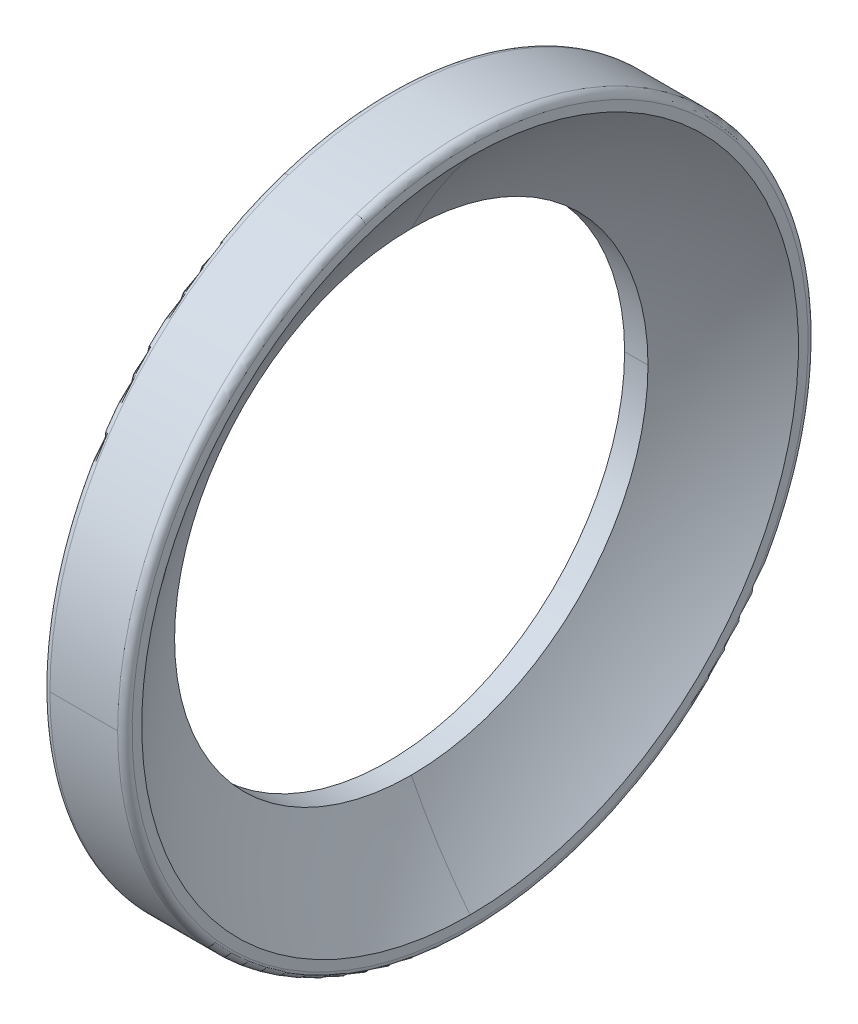
ISO-10303-21;
HEADER;
FILE_DESCRIPTION(('STEP AP214'),'2;1');
FILE_NAME('part.step','',(''),(''),'','','');
FILE_SCHEMA(('AUTOMOTIVE_DESIGN { 1 0 10303 214 1 1 1 1 }'));
ENDSEC;
DATA;
#1=APPLICATION_CONTEXT('core data for automotive mechanical design processes');
#2=APPLICATION_PROTOCOL_DEFINITION('international standard','automotive_design',2000,#1);
#3=PRODUCT_CONTEXT('',#1,'mechanical');
#4=PRODUCT('Part','Part','',(#3));
#5=PRODUCT_RELATED_PRODUCT_CATEGORY('part','',(#4));
#6=PRODUCT_DEFINITION_FORMATION('','',#4);
#7=PRODUCT_DEFINITION_CONTEXT('part definition',#1,'design');
#8=PRODUCT_DEFINITION('design','',#6,#7);
#9=PRODUCT_DEFINITION_SHAPE('','',#8);
#10=(LENGTH_UNIT() NAMED_UNIT(*) SI_UNIT(.MILLI.,.METRE.));
#11=(NAMED_UNIT(*) PLANE_ANGLE_UNIT() SI_UNIT($,.RADIAN.));
#12=(NAMED_UNIT(*) SI_UNIT($,.STERADIAN.) SOLID_ANGLE_UNIT());
#13=UNCERTAINTY_MEASURE_WITH_UNIT(LENGTH_MEASURE(1.E-05),#10,'distance_accuracy_value','');
#14=(GEOMETRIC_REPRESENTATION_CONTEXT(3) GLOBAL_UNCERTAINTY_ASSIGNED_CONTEXT((#13)) GLOBAL_UNIT_ASSIGNED_CONTEXT((#10,
#11,#12)) REPRESENTATION_CONTEXT('',''));
#15=CARTESIAN_POINT('',(0.,0.,0.));
#16=DIRECTION('',(0.,0.,1.));
#17=DIRECTION('',(1.,0.,0.));
#18=AXIS2_PLACEMENT_3D('',#15,#16,#17);
#19=CARTESIAN_POINT('',(1.10000000000035,0.,0.));
#20=DIRECTION('',(1.,0.,0.));
#21=DIRECTION('',(0.,-0.309016994374947,0.951056516295154));
#22=AXIS2_PLACEMENT_3D('',#19,#20,#21);
#23=TOROIDAL_SURFACE('',#22,51.4,1.10000000000034);
#24=CARTESIAN_POINT('',(1.10000000000035,-48.8843049375709,-15.8834735108723));
#25=DIRECTION('',(0.,0.309016994374947,-0.951056516295154));
#26=DIRECTION('',(-3.19340513628445E-13,-0.951056516295154,-0.309016994374947));
#27=AXIS2_PLACEMENT_3D('',#24,#25,#26);
#28=CIRCLE('',#27,1.10000000000034);
#29=CARTESIAN_POINT('',(1.1,-49.9304671054959,-16.2233922046848));
#30=VERTEX_POINT('',#29);
#31=CARTESIAN_POINT('',(0.,-48.8843049375709,-15.8834735108723));
#32=VERTEX_POINT('',#31);
#33=EDGE_CURVE('E10',#30,#32,#28,.T.);
#34=ORIENTED_EDGE('',*,*,#33,.T.);
#35=CARTESIAN_POINT('',(0.,-48.8843049375709,-15.8834735108723));
#36=CARTESIAN_POINT('',(0.,-48.6244289147353,-16.6833474006874));
#37=CARTESIAN_POINT('',(0.,-48.3448883269012,-17.4768302898548));
#38=CARTESIAN_POINT('',(0.,-47.7472247650473,-19.049130361772));
#39=CARTESIAN_POINT('',(0.,-47.4291017910275,-19.8279475445217));
#40=CARTESIAN_POINT('',(0.,-46.7550202006141,-21.3690324984812));
#41=CARTESIAN_POINT('',(0.,-46.3990615842203,-22.1313002696909));
#42=CARTESIAN_POINT('',(0.,-45.6501715076817,-23.6374520313352));
#43=CARTESIAN_POINT('',(0.,-45.2572400475369,-24.3813360217698));
#44=CARTESIAN_POINT('',(0.,-44.4353494795467,-25.8489276041171));
#45=CARTESIAN_POINT('',(0.,-44.0063903717014,-26.5726351960299));
#46=CARTESIAN_POINT('',(0.,-43.1134782862499,-27.9981306499916));
#47=CARTESIAN_POINT('',(0.,-42.6495253086437,-28.6999185120404));
#48=CARTESIAN_POINT('',(0.,-41.6877430857792,-30.079883799358));
#49=CARTESIAN_POINT('',(0.,-41.1899138405209,-30.7580612246268));
#50=CARTESIAN_POINT('',(0.,-40.1615784237391,-32.0891718598779));
#51=CARTESIAN_POINT('',(0.,-39.6310722522155,-32.7421050698603));
#52=CARTESIAN_POINT('',(0.,-38.5386610114677,-34.0211542984825));
#53=CARTESIAN_POINT('',(0.,-37.9767559422435,-34.6472703171223));
#54=CARTESIAN_POINT('',(0.,-36.8229005865709,-35.8711767954695));
#55=CARTESIAN_POINT('',(0.,-36.2309503001226,-36.4689672551768));
#56=CARTESIAN_POINT('',(0.,-35.0184305695688,-37.6347824858831));
#57=CARTESIAN_POINT('',(0.,-34.3978611254634,-38.202807256882));
#58=CARTESIAN_POINT('',(0.,-33.1295980858814,-39.3077226887981));
#59=CARTESIAN_POINT('',(0.,-32.4819044904049,-39.8446133497152));
#60=CARTESIAN_POINT('',(0.,-31.1609534986462,-40.8859671448253));
#61=CARTESIAN_POINT('',(0.,-30.4876961023639,-41.3904302790182));
#62=CARTESIAN_POINT('',(0.,-29.1172394450418,-42.3657137248076));
#63=CARTESIAN_POINT('',(0.,-28.4200401840019,-42.8365340364041));
#64=CARTESIAN_POINT('',(0.,-27.0033794112491,-43.74339758963));
#65=CARTESIAN_POINT('',(0.,-26.2839178995361,-44.1794408312595));
#66=CARTESIAN_POINT('',(0.,-24.8244658712369,-45.0156997781896));
#67=CARTESIAN_POINT('',(0.,-24.0844753546507,-45.4159154834902));
#68=CARTESIAN_POINT('',(0.,-22.5857480185748,-46.1795552030739));
#69=CARTESIAN_POINT('',(0.,-21.8270111990852,-46.5429792173569));
#70=CARTESIAN_POINT('',(0.,-20.292619120658,-47.2321600346227));
#71=CARTESIAN_POINT('',(0.,-19.5169638617206,-47.5579168376055));
#72=CARTESIAN_POINT('',(0.,-17.9506035258561,-48.1709784555995));
#73=CARTESIAN_POINT('',(0.,-17.1598984489291,-48.4582832706107));
#74=CARTESIAN_POINT('',(0.,-15.5653433548732,-48.9937487701973));
#75=CARTESIAN_POINT('',(0.,-14.7614933377444,-49.2419094547727));
#76=CARTESIAN_POINT('',(0.,-13.1425849083854,-49.6984888526622));
#77=CARTESIAN_POINT('',(0.,-12.3275264961551,-49.9069075659763));
#78=CARTESIAN_POINT('',(0.,-10.6881648236988,-50.2835009224075));
#79=CARTESIAN_POINT('',(0.,-9.8638615634727,-50.4516755655246));
#80=CARTESIAN_POINT('',(0.,-8.20799601377916,-50.7473756341162));
#81=CARTESIAN_POINT('',(0.,-7.37643372431167,-50.8749010595907));
#82=CARTESIAN_POINT('',(0.,-5.70805342252684,-51.0889954729772));
#83=CARTESIAN_POINT('',(0.,-4.8712354102095,-51.1755644608892));
#84=CARTESIAN_POINT('',(0.,-3.19435963061321,-51.3075374468763));
#85=CARTESIAN_POINT('',(0.,-2.35430186333428,-51.3529414449514));
#86=CARTESIAN_POINT('',(0.,-0.67297034655657,-51.4024750690564));
#87=CARTESIAN_POINT('',(0.,0.168303402942198,-51.4066046950863));
#88=CARTESIAN_POINT('',(0.,1.85004018201015,-51.37357962647));
#89=CARTESIAN_POINT('',(0.,2.69050321157934,-51.3364249318239));
#90=CARTESIAN_POINT('',(0.,4.36859380173403,-51.2209207307694));
#91=CARTESIAN_POINT('',(0.,5.20622136231953,-51.142571224361));
#92=CARTESIAN_POINT('',(0.,6.8766230963459,-50.9448661506055));
#93=CARTESIAN_POINT('',(0.,7.70939726978675,-50.8255105832584));
#94=CARTESIAN_POINT('',(0.,9.36808600359763,-50.5460809256416));
#95=CARTESIAN_POINT('',(0.,10.1940005639676,-50.3860068353718));
#96=CARTESIAN_POINT('',(0.,11.8369803711193,-50.0255257644139));
#97=CARTESIAN_POINT('',(0.,12.6540456179009,-49.8251187837258));
#98=CARTESIAN_POINT('',(0.,14.2773584161299,-49.3844547299013));
#99=CARTESIAN_POINT('',(0.,15.0836059675772,-49.1441976567649));
#100=CARTESIAN_POINT('',(0.,16.6833410541671,-48.624412218377));
#101=CARTESIAN_POINT('',(0.,17.4768285893097,-48.3448838531255));
#102=CARTESIAN_POINT('',(0.,19.0491320623168,-47.7472292388231));
#103=CARTESIAN_POINT('',(0.,19.8279480001812,-47.4291029897722));
#104=CARTESIAN_POINT('',(0.,21.3690320428214,-46.7550190018695));
#105=CARTESIAN_POINT('',(0.,22.1313001475971,-46.3990612630177));
#106=CARTESIAN_POINT('',(0.,23.6374521534287,-45.6501718288844));
#107=CARTESIAN_POINT('',(0.,24.3813360544845,-45.2572401336029));
#108=CARTESIAN_POINT('',(0.,25.8489275714021,-44.4353493934808));
#109=CARTESIAN_POINT('',(0.,26.5726351872639,-44.0063903486402));
#110=CARTESIAN_POINT('',(0.,27.9981306587574,-43.1134783093113));
#111=CARTESIAN_POINT('',(0.,28.6999185143891,-42.649525314823));
#112=CARTESIAN_POINT('',(0.,30.0798837970091,-41.6877430796));
#113=CARTESIAN_POINT('',(0.,30.7580612239973,-41.1899138388652));
#114=CARTESIAN_POINT('',(0.,32.0891718605072,-40.1615784253949));
#115=CARTESIAN_POINT('',(0.,32.7421050700288,-39.6310722526592));
#116=CARTESIAN_POINT('',(0.,34.0211542983137,-38.5386610110242));
#117=CARTESIAN_POINT('',(0.,34.647270317077,-37.9767559421247));
#118=CARTESIAN_POINT('',(0.,35.8711767955145,-36.8229005866899));
#119=CARTESIAN_POINT('',(0.,36.4689672551888,-36.2309503001546));
#120=CARTESIAN_POINT('',(0.,37.6347824858709,-35.0184305695371));
#121=CARTESIAN_POINT('',(0.,38.2028072568787,-34.3978611254549));
#122=CARTESIAN_POINT('',(0.,39.3077226888012,-33.12959808589));
#123=CARTESIAN_POINT('',(0.,39.844613349716,-32.4819044904073));
#124=CARTESIAN_POINT('',(0.,40.8859671448243,-31.160953498644));
#125=CARTESIAN_POINT('',(0.,41.3904302790179,-30.4876961023634));
#126=CARTESIAN_POINT('',(0.,42.3657137248078,-29.1172394450425));
#127=CARTESIAN_POINT('',(0.,42.8365340364041,-28.4200401840022));
#128=CARTESIAN_POINT('',(0.,43.7433975896299,-27.003379411249));
#129=CARTESIAN_POINT('',(0.,44.1794408312594,-26.2839178995362));
#130=CARTESIAN_POINT('',(0.,45.0156997781895,-24.8244658712371));
#131=CARTESIAN_POINT('',(0.,45.4159154834902,-24.0844753546509));
#132=CARTESIAN_POINT('',(0.,46.1795552030738,-22.585748018575));
#133=CARTESIAN_POINT('',(0.,46.5429792173568,-21.8270111990853));
#134=CARTESIAN_POINT('',(0.,47.2321600346227,-20.2926191206582));
#135=CARTESIAN_POINT('',(0.,47.5579168376056,-19.5169638617207));
#136=CARTESIAN_POINT('',(0.,48.1709784555993,-17.9506035258563));
#137=CARTESIAN_POINT('',(0.,48.45828327061,-17.1598984489294));
#138=CARTESIAN_POINT('',(0.,48.9937487701979,-15.5653433548732));
#139=CARTESIAN_POINT('',(0.,49.241909454775,-14.7614933377439));
#140=CARTESIAN_POINT('',(0.,49.6984888526598,-13.1425849083861));
#141=CARTESIAN_POINT('',(0.,49.9069075659674,-12.3275264961576));
#142=CARTESIAN_POINT('',(0.,50.2835009224163,-10.6881648236965));
#143=CARTESIAN_POINT('',(0.,50.4516755655575,-9.86386156346391));
#144=CARTESIAN_POINT('',(0.,50.7473756340833,-8.20799601378823));
#145=CARTESIAN_POINT('',(0.,50.874901059468,-7.37643372434513));
#146=CARTESIAN_POINT('',(0.,51.0889954730999,-5.70805342249366));
#147=CARTESIAN_POINT('',(0.,51.1755644613472,-4.87123541008529));
#148=CARTESIAN_POINT('',(0.,51.3075374464183,-3.1943596307377));
#149=CARTESIAN_POINT('',(0.,51.3529414432419,-2.35430186379848));
#150=CARTESIAN_POINT('',(0.,51.4024750707658,-0.67297034609269));
#151=CARTESIAN_POINT('',(0.,51.406604701466,0.168303404673872));
#152=CARTESIAN_POINT('',(0.,51.3735796200903,1.85004018027815));
#153=CARTESIAN_POINT('',(0.,51.3364249080144,2.69050320511586));
#154=CARTESIAN_POINT('',(0.,51.2209207545788,4.36859380819718));
#155=CARTESIAN_POINT('',(0.,51.1425713132192,5.20622138644078));
#156=CARTESIAN_POINT('',(0.,50.9448660617473,6.87662307222434));
#157=CARTESIAN_POINT('',(0.,50.8255102516352,7.70939717976428));
#158=CARTESIAN_POINT('',(0.,50.5460812572648,9.36808609361987));
#159=CARTESIAN_POINT('',(0.,50.3860080730066,10.1940008999355));
#160=CARTESIAN_POINT('',(0.,50.0255245267792,11.8369800351512));
#161=CARTESIAN_POINT('',(0.,49.82511416481,12.6540443640511));
#162=CARTESIAN_POINT('',(0.,49.3844593488172,14.2773596699794));
#163=CARTESIAN_POINT('',(0.,49.1442148947936,15.0836106470077));
#164=CARTESIAN_POINT('',(0.,48.884304937571,15.883473510872));
#165=B_SPLINE_CURVE_WITH_KNOTS('',3,(#35,#36,#37,#38,#39,#40,#41,#42,#43,#44,#45,#46,#47,#48,
#49,#50,#51,#52,#53,#54,#55,#56,#57,#58,#59,#60,#61,#62,#63,#64,#65,#66,#67,#68,#69,#70,#71,#72,
#73,#74,#75,#76,#77,#78,#79,#80,#81,#82,#83,#84,#85,#86,#87,#88,#89,#90,#91,#92,#93,#94,#95,#96,
#97,#98,#99,#100,#101,#102,#103,#104,#105,#106,#107,#108,#109,#110,#111,#112,#113,#114,#115,
#116,#117,#118,#119,#120,#121,#122,#123,#124,#125,#126,#127,#128,#129,#130,#131,#132,#133,#134,
#135,#136,#137,#138,#139,#140,#141,#142,#143,#144,#145,#146,#147,#148,#149,#150,#151,#152,#153,
#154,#155,#156,#157,#158,#159,#160,#161,#162,#163,#164),.UNSPECIFIED.,.F.,.F.,(4,2,2,2,2,2,2,2,
2,2,2,2,2,2,2,2,2,2,2,2,2,2,2,2,2,2,2,2,2,2,2,2,2,2,2,2,2,2,2,2,2,2,2,2,2,2,2,2,2,2,2,2,2,2,2,2,
2,2,2,2,2,2,2,2,4),(0.,2.52283829215539,5.04567658431075,7.56851487646614,10.0913531686215,
12.6141914607769,15.1370297529323,17.6598680450877,20.182706337243,22.7055446293984,
25.2283829215538,27.7512212137092,30.2740595058645,32.7968977980199,35.3197360901753,
37.8425743823307,40.3654126744861,42.8882509666415,45.4110892587968,47.9339275509522,
50.4567658431076,52.979604135263,55.5024424274183,58.0252807195737,60.5481190117291,
63.0709573038845,65.5937955960398,68.1166338881952,70.6394721803506,73.1623104725059,
75.6851487646613,78.2079870568167,80.7308253489721,83.2536636411275,85.7765019332828,
88.2993402254382,90.8221785175936,93.345016809749,95.8678551019044,98.3906933940598,
100.913531686215,103.43636997837,105.959208270526,108.482046562681,111.004884854837,
113.527723146992,116.050561439147,118.573399731303,121.096238023458,123.619076315614,
126.141914607769,128.664752899924,131.18759119208,133.710429484235,136.23326777639,
138.756106068546,141.278944360701,143.801782652857,146.324620945012,148.847459237167,
151.370297529323,153.893135821478,156.415974113634,158.938812405789,161.461650697944),.UNSPECIFIED.);
#166=CARTESIAN_POINT('',(0.,48.8843049375709,15.8834735108723));
#167=VERTEX_POINT('',#166);
#168=EDGE_CURVE('E25',#32,#167,#165,.T.);
#169=ORIENTED_EDGE('',*,*,#168,.T.);
#170=CARTESIAN_POINT('',(1.10000000000035,48.8843049375709,15.8834735108723));
#171=DIRECTION('',(0.,-0.309016994374948,0.951056516295153));
#172=DIRECTION('',(-3.17523785042695E-13,0.951056516295153,0.309016994374948));
#173=AXIS2_PLACEMENT_3D('',#170,#171,#172);
#174=CIRCLE('',#173,1.10000000000035);
#175=CARTESIAN_POINT('',(1.1,49.9304671054959,16.2233922046848));
#176=VERTEX_POINT('',#175);
#177=EDGE_CURVE('E257',#176,#167,#174,.T.);
#178=ORIENTED_EDGE('',*,*,#177,.F.);
#179=CARTESIAN_POINT('',(1.1,0.,0.));
#180=DIRECTION('',(1.,0.,0.));
#181=DIRECTION('',(0.,0.,-1.));
#182=AXIS2_PLACEMENT_3D('',#179,#180,#181);
#183=CIRCLE('',#182,52.5);
#184=CARTESIAN_POINT('',(1.1,0.,-52.5));
#185=VERTEX_POINT('',#184);
#186=EDGE_CURVE('E252',#185,#176,#183,.T.);
#187=ORIENTED_EDGE('',*,*,#186,.F.);
#188=CARTESIAN_POINT('',(1.1,0.,0.));
#189=DIRECTION('',(1.,0.,0.));
#190=DIRECTION('',(0.,0.,-1.));
#191=AXIS2_PLACEMENT_3D('',#188,#189,#190);
#192=CIRCLE('',#191,52.5);
#193=EDGE_CURVE('E247',#30,#185,#192,.T.);
#194=ORIENTED_EDGE('',*,*,#193,.F.);
#195=EDGE_LOOP('',(#34,#169,#178,#187,#194));
#196=FACE_BOUND('',#195,.T.);
#197=ADVANCED_FACE('F16',(#196),#23,.T.);
#198=CARTESIAN_POINT('',(15.377777777778,0.,0.));
#199=DIRECTION('',(1.,0.,0.));
#200=DIRECTION('',(0.,1.,0.));
#201=AXIS2_PLACEMENT_3D('',#198,#199,#200);
#202=CYLINDRICAL_SURFACE('',#201,52.5);
#203=DIRECTION('',(1.,0.,0.));
#204=VECTOR('',#203,1.);
#205=CARTESIAN_POINT('',(1.1,0.,52.5));
#206=LINE('',#205,#204);
#207=CARTESIAN_POINT('',(1.1,0.,52.5));
#208=VERTEX_POINT('',#207);
#209=CARTESIAN_POINT('',(11.4,0.,52.5));
#210=VERTEX_POINT('',#209);
#211=EDGE_CURVE('E242',#208,#210,#206,.T.);
#212=ORIENTED_EDGE('',*,*,#211,.F.);
#213=CARTESIAN_POINT('',(1.1,0.,0.));
#214=DIRECTION('',(1.,0.,0.));
#215=DIRECTION('',(0.,0.,-1.));
#216=AXIS2_PLACEMENT_3D('',#213,#214,#215);
#217=CIRCLE('',#216,52.5);
#218=EDGE_CURVE('E237',#208,#30,#217,.T.);
#219=ORIENTED_EDGE('',*,*,#218,.T.);
#220=ORIENTED_EDGE('',*,*,#193,.T.);
#221=DIRECTION('',(1.,0.,0.));
#222=VECTOR('',#221,1.);
#223=CARTESIAN_POINT('',(1.1,0.,-52.5));
#224=LINE('',#223,#222);
#225=CARTESIAN_POINT('',(11.4,0.,-52.5));
#226=VERTEX_POINT('',#225);
#227=EDGE_CURVE('E233',#185,#226,#224,.T.);
#228=ORIENTED_EDGE('',*,*,#227,.T.);
#229=CARTESIAN_POINT('',(11.4,0.,0.));
#230=DIRECTION('',(1.,0.,0.));
#231=DIRECTION('',(0.,0.,-1.));
#232=AXIS2_PLACEMENT_3D('',#229,#230,#231);
#233=CIRCLE('',#232,52.5);
#234=CARTESIAN_POINT('',(11.4,-49.9304671054956,-16.2233922046847));
#235=VERTEX_POINT('',#234);
#236=EDGE_CURVE('E228',#235,#226,#233,.T.);
#237=ORIENTED_EDGE('',*,*,#236,.F.);
#238=CARTESIAN_POINT('',(11.4,0.,0.));
#239=DIRECTION('',(1.,0.,0.));
#240=DIRECTION('',(0.,0.,-1.));
#241=AXIS2_PLACEMENT_3D('',#238,#239,#240);
#242=CIRCLE('',#241,52.5);
#243=EDGE_CURVE('E223',#210,#235,#242,.T.);
#244=ORIENTED_EDGE('',*,*,#243,.F.);
#245=EDGE_LOOP('',(#212,#219,#220,#228,#237,#244));
#246=FACE_BOUND('',#245,.T.);
#247=ADVANCED_FACE('F275',(#246),#202,.T.);
#248=CARTESIAN_POINT('',(11.3999999999993,0.,0.));
#249=DIRECTION('',(1.,0.,0.));
#250=DIRECTION('',(0.,0.309016994374947,-0.951056516295154));
#251=AXIS2_PLACEMENT_3D('',#248,#249,#250);
#252=TOROIDAL_SURFACE('',#251,51.3999999999993,1.10000000000069);
#253=CARTESIAN_POINT('',(11.3999999999993,-48.8843049375702,-15.8834735108721));
#254=DIRECTION('',(0.,0.309016994374947,-0.951056516295154));
#255=DIRECTION('',(1.,0.,0.));
#256=AXIS2_PLACEMENT_3D('',#253,#254,#255);
#257=CIRCLE('',#256,1.10000000000069);
#258=CARTESIAN_POINT('',(12.5,-48.8843049375702,-15.8834735108721));
#259=VERTEX_POINT('',#258);
#260=EDGE_CURVE('E218',#259,#235,#257,.T.);
#261=ORIENTED_EDGE('',*,*,#260,.F.);
#262=CARTESIAN_POINT('',(12.5,0.,0.));
#263=DIRECTION('',(1.,0.,0.));
#264=DIRECTION('',(0.,0.,-1.));
#265=AXIS2_PLACEMENT_3D('',#262,#263,#264);
#266=CIRCLE('',#265,51.4);
#267=CARTESIAN_POINT('',(12.5,48.8843049375702,15.8834735108721));
#268=VERTEX_POINT('',#267);
#269=EDGE_CURVE('E213',#268,#259,#266,.T.);
#270=ORIENTED_EDGE('',*,*,#269,.F.);
#271=CARTESIAN_POINT('',(11.3999999999993,48.8843049375702,15.8834735108721));
#272=DIRECTION('',(0.,-0.309016994374947,0.951056516295154));
#273=DIRECTION('',(1.,0.,0.));
#274=AXIS2_PLACEMENT_3D('',#271,#272,#273);
#275=CIRCLE('',#274,1.10000000000069);
#276=CARTESIAN_POINT('',(11.4,49.9304671054956,16.2233922046847));
#277=VERTEX_POINT('',#276);
#278=EDGE_CURVE('E209',#268,#277,#275,.T.);
#279=ORIENTED_EDGE('',*,*,#278,.T.);
#280=CARTESIAN_POINT('',(11.4,0.,0.));
#281=DIRECTION('',(1.,0.,0.));
#282=DIRECTION('',(0.,0.,-1.));
#283=AXIS2_PLACEMENT_3D('',#280,#281,#282);
#284=CIRCLE('',#283,52.5);
#285=EDGE_CURVE('E204',#277,#210,#284,.T.);
#286=ORIENTED_EDGE('',*,*,#285,.T.);
#287=ORIENTED_EDGE('',*,*,#243,.T.);
#288=EDGE_LOOP('',(#261,#270,#279,#286,#287));
#289=FACE_BOUND('',#288,.T.);
#290=ADVANCED_FACE('F284',(#289),#252,.T.);
#291=CARTESIAN_POINT('',(15.377777777778,0.,0.));
#292=DIRECTION('',(1.,0.,0.));
#293=DIRECTION('',(0.,-1.,0.));
#294=AXIS2_PLACEMENT_3D('',#291,#292,#293);
#295=CYLINDRICAL_SURFACE('',#294,52.5);
#296=ORIENTED_EDGE('',*,*,#211,.T.);
#297=ORIENTED_EDGE('',*,*,#285,.F.);
#298=CARTESIAN_POINT('',(11.4,0.,0.));
#299=DIRECTION('',(1.,0.,0.));
#300=DIRECTION('',(0.,0.,-1.));
#301=AXIS2_PLACEMENT_3D('',#298,#299,#300);
#302=CIRCLE('',#301,52.5);
#303=EDGE_CURVE('E199',#226,#277,#302,.T.);
#304=ORIENTED_EDGE('',*,*,#303,.F.);
#305=ORIENTED_EDGE('',*,*,#227,.F.);
#306=ORIENTED_EDGE('',*,*,#186,.T.);
#307=CARTESIAN_POINT('',(1.1,0.,0.));
#308=DIRECTION('',(1.,0.,0.));
#309=DIRECTION('',(0.,0.,-1.));
#310=AXIS2_PLACEMENT_3D('',#307,#308,#309);
#311=CIRCLE('',#310,52.5);
#312=EDGE_CURVE('E196',#176,#208,#311,.T.);
#313=ORIENTED_EDGE('',*,*,#312,.T.);
#314=EDGE_LOOP('',(#296,#297,#304,#305,#306,#313));
#315=FACE_BOUND('',#314,.T.);
#316=ADVANCED_FACE('F277',(#315),#295,.T.);
#317=CARTESIAN_POINT('',(1.10000000000035,0.,0.));
#318=DIRECTION('',(1.,0.,0.));
#319=DIRECTION('',(0.,0.309016994374947,-0.951056516295154));
#320=AXIS2_PLACEMENT_3D('',#317,#318,#319);
#321=TOROIDAL_SURFACE('',#320,51.4,1.10000000000034);
#322=ORIENTED_EDGE('',*,*,#33,.F.);
#323=ORIENTED_EDGE('',*,*,#218,.F.);
#324=ORIENTED_EDGE('',*,*,#312,.F.);
#325=ORIENTED_EDGE('',*,*,#177,.T.);
#326=CARTESIAN_POINT('',(0.,48.8843049375709,15.8834735108723));
#327=CARTESIAN_POINT('',(0.,48.6244289147353,16.6833474006874));
#328=CARTESIAN_POINT('',(0.,48.3448883269012,17.4768302898548));
#329=CARTESIAN_POINT('',(0.,47.7472247650473,19.049130361772));
#330=CARTESIAN_POINT('',(0.,47.4291017910275,19.8279475445217));
#331=CARTESIAN_POINT('',(0.,46.7550202006141,21.3690324984812));
#332=CARTESIAN_POINT('',(0.,46.3990615842203,22.1313002696909));
#333=CARTESIAN_POINT('',(0.,45.6501715076817,23.6374520313352));
#334=CARTESIAN_POINT('',(0.,45.2572400475369,24.3813360217698));
#335=CARTESIAN_POINT('',(0.,44.4353494795467,25.8489276041172));
#336=CARTESIAN_POINT('',(0.,44.0063903717014,26.5726351960299));
#337=CARTESIAN_POINT('',(0.,43.1134782862499,27.9981306499916));
#338=CARTESIAN_POINT('',(0.,42.6495253086437,28.6999185120405));
#339=CARTESIAN_POINT('',(0.,41.6877430857792,30.079883799358));
#340=CARTESIAN_POINT('',(0.,41.1899138405209,30.7580612246268));
#341=CARTESIAN_POINT('',(0.,40.161578423739,32.0891718598779));
#342=CARTESIAN_POINT('',(0.,39.6310722522155,32.7421050698603));
#343=CARTESIAN_POINT('',(0.,38.5386610114677,34.0211542984825));
#344=CARTESIAN_POINT('',(0.,37.9767559422435,34.6472703171223));
#345=CARTESIAN_POINT('',(0.,36.8229005865709,35.8711767954695));
#346=CARTESIAN_POINT('',(0.,36.2309503001226,36.4689672551769));
#347=CARTESIAN_POINT('',(0.,35.0184305695688,37.6347824858831));
#348=CARTESIAN_POINT('',(0.,34.3978611254633,38.202807256882));
#349=CARTESIAN_POINT('',(0.,33.1295980858814,39.3077226887981));
#350=CARTESIAN_POINT('',(0.,32.4819044904049,39.8446133497152));
#351=CARTESIAN_POINT('',(0.,31.1609534986461,40.8859671448253));
#352=CARTESIAN_POINT('',(0.,30.4876961023639,41.3904302790182));
#353=CARTESIAN_POINT('',(0.,29.1172394450418,42.3657137248076));
#354=CARTESIAN_POINT('',(0.,28.4200401840019,42.8365340364041));
#355=CARTESIAN_POINT('',(0.,27.003379411249,43.7433975896301));
#356=CARTESIAN_POINT('',(0.,26.2839178995361,44.1794408312595));
#357=CARTESIAN_POINT('',(0.,24.8244658712369,45.0156997781896));
#358=CARTESIAN_POINT('',(0.,24.0844753546507,45.4159154834903));
#359=CARTESIAN_POINT('',(0.,22.5857480185748,46.1795552030739));
#360=CARTESIAN_POINT('',(0.,21.8270111990851,46.5429792173569));
#361=CARTESIAN_POINT('',(0.,20.292619120658,47.2321600346227));
#362=CARTESIAN_POINT('',(0.,19.5169638617206,47.5579168376055));
#363=CARTESIAN_POINT('',(0.,17.9506035258561,48.1709784555995));
#364=CARTESIAN_POINT('',(0.,17.159898448929,48.4582832706107));
#365=CARTESIAN_POINT('',(0.,15.5653433548732,48.9937487701973));
#366=CARTESIAN_POINT('',(0.,14.7614933377444,49.2419094547727));
#367=CARTESIAN_POINT('',(0.,13.1425849083853,49.6984888526622));
#368=CARTESIAN_POINT('',(0.,12.327526496155,49.9069075659763));
#369=CARTESIAN_POINT('',(0.,10.6881648236987,50.2835009224075));
#370=CARTESIAN_POINT('',(0.,9.86386156347265,50.4516755655246));
#371=CARTESIAN_POINT('',(0.,8.20799601377911,50.7473756341162));
#372=CARTESIAN_POINT('',(0.,7.37643372431162,50.8749010595907));
#373=CARTESIAN_POINT('',(0.,5.70805342252679,51.0889954729772));
#374=CARTESIAN_POINT('',(0.,4.87123541020945,51.1755644608892));
#375=CARTESIAN_POINT('',(0.,3.19435963061316,51.3075374468763));
#376=CARTESIAN_POINT('',(0.,2.35430186333423,51.3529414449514));
#377=CARTESIAN_POINT('',(0.,0.672970346556528,51.4024750690564));
#378=CARTESIAN_POINT('',(0.,-0.168303402942233,51.4066046950863));
#379=CARTESIAN_POINT('',(0.,-1.85004018201019,51.37357962647));
#380=CARTESIAN_POINT('',(0.,-2.69050321157938,51.3364249318239));
#381=CARTESIAN_POINT('',(0.,-4.36859380173408,51.2209207307694));
#382=CARTESIAN_POINT('',(0.,-5.20622136231958,51.142571224361));
#383=CARTESIAN_POINT('',(0.,-6.87662309634596,50.9448661506055));
#384=CARTESIAN_POINT('',(0.,-7.70939726978683,50.8255105832584));
#385=CARTESIAN_POINT('',(0.,-9.36808600359771,50.5460809256415));
#386=CARTESIAN_POINT('',(0.,-10.1940005639677,50.3860068353718));
#387=CARTESIAN_POINT('',(0.,-11.8369803711193,50.0255257644139));
#388=CARTESIAN_POINT('',(0.,-12.654045617901,49.8251187837258));
#389=CARTESIAN_POINT('',(0.,-14.2773584161299,49.3844547299013));
#390=CARTESIAN_POINT('',(0.,-15.0836059675772,49.1441976567649));
#391=CARTESIAN_POINT('',(0.,-16.6833410541672,48.624412218377));
#392=CARTESIAN_POINT('',(0.,-17.4768285893098,48.3448838531255));
#393=CARTESIAN_POINT('',(0.,-19.0491320623168,47.7472292388231));
#394=CARTESIAN_POINT('',(0.,-19.8279480001812,47.4291029897722));
#395=CARTESIAN_POINT('',(0.,-21.3690320428214,46.7550190018695));
#396=CARTESIAN_POINT('',(0.,-22.1313001475972,46.3990612630177));
#397=CARTESIAN_POINT('',(0.,-23.6374521534288,45.6501718288844));
#398=CARTESIAN_POINT('',(0.,-24.3813360544846,45.2572401336029));
#399=CARTESIAN_POINT('',(0.,-25.8489275714022,44.4353493934808));
#400=CARTESIAN_POINT('',(0.,-26.5726351872639,44.0063903486402));
#401=CARTESIAN_POINT('',(0.,-27.9981306587574,43.1134783093113));
#402=CARTESIAN_POINT('',(0.,-28.6999185143892,42.649525314823));
#403=CARTESIAN_POINT('',(0.,-30.0798837970092,41.6877430795999));
#404=CARTESIAN_POINT('',(0.,-30.7580612239973,41.1899138388652));
#405=CARTESIAN_POINT('',(0.,-32.0891718605072,40.1615784253948));
#406=CARTESIAN_POINT('',(0.,-32.7421050700289,39.6310722526592));
#407=CARTESIAN_POINT('',(0.,-34.0211542983138,38.5386610110241));
#408=CARTESIAN_POINT('',(0.,-34.647270317077,37.9767559421246));
#409=CARTESIAN_POINT('',(0.,-35.8711767955146,36.8229005866898));
#410=CARTESIAN_POINT('',(0.,-36.4689672551889,36.2309503001545));
#411=CARTESIAN_POINT('',(0.,-37.634782485871,35.018430569537));
#412=CARTESIAN_POINT('',(0.,-38.2028072568787,34.3978611254549));
#413=CARTESIAN_POINT('',(0.,-39.3077226888013,33.12959808589));
#414=CARTESIAN_POINT('',(0.,-39.844613349716,32.4819044904072));
#415=CARTESIAN_POINT('',(0.,-40.8859671448244,31.1609534986439));
#416=CARTESIAN_POINT('',(0.,-41.3904302790179,30.4876961023634));
#417=CARTESIAN_POINT('',(0.,-42.3657137248078,29.1172394450425));
#418=CARTESIAN_POINT('',(0.,-42.8365340364041,28.4200401840021));
#419=CARTESIAN_POINT('',(0.,-43.7433975896299,27.003379411249));
#420=CARTESIAN_POINT('',(0.,-44.1794408312594,26.2839178995361));
#421=CARTESIAN_POINT('',(0.,-45.0156997781895,24.824465871237));
#422=CARTESIAN_POINT('',(0.,-45.4159154834902,24.0844753546508));
#423=CARTESIAN_POINT('',(0.,-46.1795552030739,22.5857480185749));
#424=CARTESIAN_POINT('',(0.,-46.5429792173568,21.8270111990852));
#425=CARTESIAN_POINT('',(0.,-47.2321600346227,20.2926191206581));
#426=CARTESIAN_POINT('',(0.,-47.5579168376056,19.5169638617206));
#427=CARTESIAN_POINT('',(0.,-48.1709784555993,17.9506035258562));
#428=CARTESIAN_POINT('',(0.,-48.45828327061,17.1598984489293));
#429=CARTESIAN_POINT('',(0.,-48.9937487701979,15.5653433548731));
#430=CARTESIAN_POINT('',(0.,-49.241909454775,14.7614933377439));
#431=CARTESIAN_POINT('',(0.,-49.6984888526598,13.1425849083861));
#432=CARTESIAN_POINT('',(0.,-49.9069075659675,12.3275264961576));
#433=CARTESIAN_POINT('',(0.,-50.2835009224163,10.6881648236964));
#434=CARTESIAN_POINT('',(0.,-50.4516755655575,9.86386156346383));
#435=CARTESIAN_POINT('',(0.,-50.7473756340833,8.20799601378815));
#436=CARTESIAN_POINT('',(0.,-50.874901059468,7.37643372434506));
#437=CARTESIAN_POINT('',(0.,-51.0889954730999,5.7080534224936));
#438=CARTESIAN_POINT('',(0.,-51.1755644613473,4.87123541008521));
#439=CARTESIAN_POINT('',(0.,-51.3075374464183,3.1943596307376));
#440=CARTESIAN_POINT('',(0.,-51.3529414432419,2.35430186379838));
#441=CARTESIAN_POINT('',(0.,-51.4024750707658,0.672970346092592));
#442=CARTESIAN_POINT('',(0.,-51.406604701466,-0.16830340467397));
#443=CARTESIAN_POINT('',(0.,-51.3735796200903,-1.85004018027824));
#444=CARTESIAN_POINT('',(0.,-51.3364249080144,-2.69050320511595));
#445=CARTESIAN_POINT('',(0.,-51.2209207545788,-4.36859380819727));
#446=CARTESIAN_POINT('',(0.,-51.1425713132192,-5.20622138644088));
#447=CARTESIAN_POINT('',(0.,-50.9448660617473,-6.87662307222442));
#448=CARTESIAN_POINT('',(0.,-50.8255102516352,-7.70939717976434));
#449=CARTESIAN_POINT('',(0.,-50.5460812572648,-9.36808609361992));
#450=CARTESIAN_POINT('',(0.,-50.3860080730066,-10.1940008999356));
#451=CARTESIAN_POINT('',(0.,-50.0255245267792,-11.8369800351512));
#452=CARTESIAN_POINT('',(0.,-49.82511416481,-12.6540443640512));
#453=CARTESIAN_POINT('',(0.,-49.3844593488172,-14.2773596699795));
#454=CARTESIAN_POINT('',(0.,-49.1442148947935,-15.0836106470077));
#455=CARTESIAN_POINT('',(0.,-48.8843049375709,-15.8834735108721));
#456=B_SPLINE_CURVE_WITH_KNOTS('',3,(#326,#327,#328,#329,#330,#331,#332,#333,#334,#335,#336,
#337,#338,#339,#340,#341,#342,#343,#344,#345,#346,#347,#348,#349,#350,#351,#352,#353,#354,#355,
#356,#357,#358,#359,#360,#361,#362,#363,#364,#365,#366,#367,#368,#369,#370,#371,#372,#373,#374,
#375,#376,#377,#378,#379,#380,#381,#382,#383,#384,#385,#386,#387,#388,#389,#390,#391,#392,#393,
#394,#395,#396,#397,#398,#399,#400,#401,#402,#403,#404,#405,#406,#407,#408,#409,#410,#411,#412,
#413,#414,#415,#416,#417,#418,#419,#420,#421,#422,#423,#424,#425,#426,#427,#428,#429,#430,#431,
#432,#433,#434,#435,#436,#437,#438,#439,#440,#441,#442,#443,#444,#445,#446,#447,#448,#449,#450,
#451,#452,#453,#454,#455),.UNSPECIFIED.,.F.,.F.,(4,2,2,2,2,2,2,2,2,2,2,2,2,2,2,2,2,2,2,2,2,2,2,
2,2,2,2,2,2,2,2,2,2,2,2,2,2,2,2,2,2,2,2,2,2,2,2,2,2,2,2,2,2,2,2,2,2,2,2,2,2,2,2,2,4),(0.,
2.52283829215539,5.04567658431075,7.56851487646615,10.0913531686215,12.6141914607769,
15.1370297529323,17.6598680450877,20.182706337243,22.7055446293984,25.2283829215538,
27.7512212137092,30.2740595058646,32.7968977980199,35.3197360901753,37.8425743823307,
40.3654126744861,42.8882509666415,45.4110892587968,47.9339275509522,50.4567658431076,
52.979604135263,55.5024424274184,58.0252807195737,60.5481190117291,63.0709573038845,
65.5937955960399,68.1166338881953,70.6394721803506,73.162310472506,75.6851487646614,
78.2079870568167,80.7308253489721,83.2536636411275,85.7765019332829,88.2993402254383,
90.8221785175937,93.3450168097491,95.8678551019044,98.3906933940598,100.913531686215,
103.436369978371,105.959208270526,108.482046562681,111.004884854837,113.527723146992,
116.050561439147,118.573399731303,121.096238023458,123.619076315614,126.141914607769,
128.664752899924,131.18759119208,133.710429484235,136.233267776391,138.756106068546,
141.278944360701,143.801782652857,146.324620945012,148.847459237167,151.370297529323,
153.893135821478,156.415974113634,158.938812405789,161.461650697944),.UNSPECIFIED.);
#457=EDGE_CURVE('E182',#167,#32,#456,.T.);
#458=ORIENTED_EDGE('',*,*,#457,.T.);
#459=EDGE_LOOP('',(#322,#323,#324,#325,#458));
#460=FACE_BOUND('',#459,.T.);
#461=ADVANCED_FACE('F161',(#460),#321,.T.);
#462=CARTESIAN_POINT('',(0.,51.4,0.));
#463=DIRECTION('',(-1.,0.,0.));
#464=DIRECTION('',(0.,0.,1.));
#465=AXIS2_PLACEMENT_3D('',#462,#463,#464);
#466=PLANE('',#465);
#467=CARTESIAN_POINT('',(0.,0.,0.));
#468=DIRECTION('',(1.,0.,0.));
#469=DIRECTION('',(0.,0.,-1.));
#470=AXIS2_PLACEMENT_3D('',#467,#468,#469);
#471=CIRCLE('',#470,36.);
#472=CARTESIAN_POINT('',(0.,0.,-36.));
#473=VERTEX_POINT('',#472);
#474=CARTESIAN_POINT('',(0.,0.,36.));
#475=VERTEX_POINT('',#474);
#476=EDGE_CURVE('E178',#473,#475,#471,.T.);
#477=ORIENTED_EDGE('',*,*,#476,.T.);
#478=CARTESIAN_POINT('',(0.,0.,0.));
#479=DIRECTION('',(1.,0.,0.));
#480=DIRECTION('',(0.,0.,-1.));
#481=AXIS2_PLACEMENT_3D('',#478,#479,#480);
#482=CIRCLE('',#481,36.);
#483=EDGE_CURVE('E142',#475,#473,#482,.T.);
#484=ORIENTED_EDGE('',*,*,#483,.T.);
#485=EDGE_LOOP('',(#477,#484));
#486=FACE_BOUND('',#485,.T.);
#487=ORIENTED_EDGE('',*,*,#168,.F.);
#488=ORIENTED_EDGE('',*,*,#457,.F.);
#489=EDGE_LOOP('',(#487,#488));
#490=FACE_BOUND('',#489,.T.);
#491=ADVANCED_FACE('F150',(#486,#490),#466,.T.);
#492=CARTESIAN_POINT('',(15.377777777778,0.,0.));
#493=DIRECTION('',(1.,0.,0.));
#494=DIRECTION('',(0.,1.,0.));
#495=AXIS2_PLACEMENT_3D('',#492,#493,#494);
#496=CYLINDRICAL_SURFACE('',#495,36.);
#497=DIRECTION('',(1.,0.,0.));
#498=VECTOR('',#497,1.);
#499=CARTESIAN_POINT('',(0.,0.,36.));
#500=LINE('',#499,#498);
#501=CARTESIAN_POINT('',(3.557715602033,0.,36.));
#502=VERTEX_POINT('',#501);
#503=EDGE_CURVE('E138',#475,#502,#500,.T.);
#504=ORIENTED_EDGE('',*,*,#503,.T.);
#505=CARTESIAN_POINT('',(3.557715602033,0.,0.));
#506=DIRECTION('',(1.,0.,0.));
#507=DIRECTION('',(0.,0.,-1.));
#508=AXIS2_PLACEMENT_3D('',#505,#506,#507);
#509=CIRCLE('',#508,36.);
#510=CARTESIAN_POINT('',(3.55771560203378,-35.9999999999976,0.));
#511=VERTEX_POINT('',#510);
#512=EDGE_CURVE('E134',#502,#511,#509,.T.);
#513=ORIENTED_EDGE('',*,*,#512,.T.);
#514=CARTESIAN_POINT('',(3.557715602033,0.,0.));
#515=DIRECTION('',(1.,0.,0.));
#516=DIRECTION('',(0.,0.,-1.));
#517=AXIS2_PLACEMENT_3D('',#514,#515,#516);
#518=CIRCLE('',#517,36.);
#519=CARTESIAN_POINT('',(3.557715602033,0.,-36.));
#520=VERTEX_POINT('',#519);
#521=EDGE_CURVE('E111',#511,#520,#518,.T.);
#522=ORIENTED_EDGE('',*,*,#521,.T.);
#523=DIRECTION('',(1.,0.,0.));
#524=VECTOR('',#523,1.);
#525=CARTESIAN_POINT('',(0.,0.,-36.));
#526=LINE('',#525,#524);
#527=EDGE_CURVE('E126',#473,#520,#526,.T.);
#528=ORIENTED_EDGE('',*,*,#527,.F.);
#529=ORIENTED_EDGE('',*,*,#483,.F.);
#530=EDGE_LOOP('',(#504,#513,#522,#528,#529));
#531=FACE_BOUND('',#530,.T.);
#532=ADVANCED_FACE('F160',(#531),#496,.F.);
#533=CARTESIAN_POINT('',(15.377777777778,0.,0.));
#534=DIRECTION('',(1.,0.,0.));
#535=DIRECTION('',(0.,-1.,0.));
#536=AXIS2_PLACEMENT_3D('',#533,#534,#535);
#537=CYLINDRICAL_SURFACE('',#536,36.);
#538=ORIENTED_EDGE('',*,*,#503,.F.);
#539=ORIENTED_EDGE('',*,*,#476,.F.);
#540=ORIENTED_EDGE('',*,*,#527,.T.);
#541=CARTESIAN_POINT('',(3.557715602033,0.,0.));
#542=DIRECTION('',(1.,0.,0.));
#543=DIRECTION('',(0.,0.,-1.));
#544=AXIS2_PLACEMENT_3D('',#541,#542,#543);
#545=CIRCLE('',#544,36.);
#546=CARTESIAN_POINT('',(3.55771560203378,36.0000000000016,0.));
#547=VERTEX_POINT('',#546);
#548=EDGE_CURVE('E115',#520,#547,#545,.T.);
#549=ORIENTED_EDGE('',*,*,#548,.T.);
#550=CARTESIAN_POINT('',(3.557715602033,0.,0.));
#551=DIRECTION('',(1.,0.,0.));
#552=DIRECTION('',(0.,0.,-1.));
#553=AXIS2_PLACEMENT_3D('',#550,#551,#552);
#554=CIRCLE('',#553,36.);
#555=EDGE_CURVE('E112',#547,#502,#554,.T.);
#556=ORIENTED_EDGE('',*,*,#555,.T.);
#557=EDGE_LOOP('',(#538,#539,#540,#549,#556));
#558=FACE_BOUND('',#557,.T.);
#559=ADVANCED_FACE('F298',(#558),#537,.F.);
#560=CARTESIAN_POINT('',(74.9999999999945,1.98452365651746E-12,0.));
#561=DIRECTION('',(1.,0.,0.));
#562=DIRECTION('',(0.,0.,-1.));
#563=AXIS2_PLACEMENT_3D('',#560,#561,#562);
#564=SPHERICAL_SURFACE('',#563,79.9999999999942);
#565=CARTESIAN_POINT('',(74.9999999999945,1.98452365651746E-12,0.));
#566=DIRECTION('',(0.,0.,-1.));
#567=DIRECTION('',(-0.781249999999976,-0.624218261107473,0.));
#568=AXIS2_PLACEMENT_3D('',#565,#566,#567);
#569=CIRCLE('',#568,79.9999999999942);
#570=CARTESIAN_POINT('',(12.5000000000009,-49.9374608885922,0.));
#571=VERTEX_POINT('',#570);
#572=EDGE_CURVE('E96',#571,#511,#569,.T.);
#573=ORIENTED_EDGE('',*,*,#572,.T.);
#574=ORIENTED_EDGE('',*,*,#512,.F.);
#575=ORIENTED_EDGE('',*,*,#555,.F.);
#576=CARTESIAN_POINT('',(74.9999999999945,1.98452365651746E-12,0.));
#577=DIRECTION('',(0.,0.,1.));
#578=DIRECTION('',(-0.781249999999976,0.624218261107473,0.));
#579=AXIS2_PLACEMENT_3D('',#576,#577,#578);
#580=CIRCLE('',#579,79.9999999999942);
#581=CARTESIAN_POINT('',(12.5000000000009,49.9374608885962,0.));
#582=VERTEX_POINT('',#581);
#583=EDGE_CURVE('E100',#582,#547,#580,.T.);
#584=ORIENTED_EDGE('',*,*,#583,.F.);
#585=CARTESIAN_POINT('',(12.5,0.,0.));
#586=DIRECTION('',(1.,0.,0.));
#587=DIRECTION('',(0.,0.,-1.));
#588=AXIS2_PLACEMENT_3D('',#585,#586,#587);
#589=CIRCLE('',#588,49.937460888595);
#590=EDGE_CURVE('E91',#582,#571,#589,.T.);
#591=ORIENTED_EDGE('',*,*,#590,.T.);
#592=EDGE_LOOP('',(#573,#574,#575,#584,#591));
#593=FACE_BOUND('',#592,.T.);
#594=ADVANCED_FACE('F93',(#593),#564,.F.);
#595=CARTESIAN_POINT('',(12.5,49.937460888595,0.));
#596=DIRECTION('',(1.,0.,0.));
#597=DIRECTION('',(0.,0.,-1.));
#598=AXIS2_PLACEMENT_3D('',#595,#596,#597);
#599=PLANE('',#598);
#600=ORIENTED_EDGE('',*,*,#269,.T.);
#601=CARTESIAN_POINT('',(12.5,-48.8843049375709,-15.8834735108723));
#602=CARTESIAN_POINT('',(12.5,-46.3892334167402,-23.5621303265741));
#603=CARTESIAN_POINT('',(12.5,-42.3870821399645,-30.751346667665));
#604=CARTESIAN_POINT('',(12.5,-37.0033687806042,-37.0545254108557));
#605=CARTESIAN_POINT('',(12.5,-24.0546836798937,-47.2099568851706));
#606=CARTESIAN_POINT('',(12.5,-8.22771060605926,-51.7165021919314));
#607=CARTESIAN_POINT('',(12.5,0.0361751757350856,-52.3668982000426));
#608=CARTESIAN_POINT('',(12.5,16.373247364706,-50.3916738644538));
#609=CARTESIAN_POINT('',(12.5,30.7512241383421,-42.3869738213334));
#610=CARTESIAN_POINT('',(12.5,37.0545549936695,-37.0034022085298));
#611=CARTESIAN_POINT('',(12.5,47.2099643098146,-24.0546691082096));
#612=CARTESIAN_POINT('',(12.5,51.7164577598297,-8.22770632150177));
#613=CARTESIAN_POINT('',(12.5,52.3670578525851,0.0361397155244951));
#614=CARTESIAN_POINT('',(12.5,51.3791509087226,8.20474340963728));
#615=CARTESIAN_POINT('',(12.5,48.8843049375709,15.8834735108723));
#616=B_SPLINE_CURVE_WITH_KNOTS('',5,(#601,#602,#603,#604,#605,#606,#607,#608,#609,#610,#611,
#612,#613,#614,#615),.UNSPECIFIED.,.F.,.F.,(6,3,3,3,6),(0.,0.785398163397448,1.5707963267949,
2.35619449019234,3.14159265358979),.UNSPECIFIED.);
#617=EDGE_CURVE('E103',#259,#268,#616,.T.);
#618=ORIENTED_EDGE('',*,*,#617,.T.);
#619=EDGE_LOOP('',(#600,#618));
#620=FACE_BOUND('',#619,.T.);
#621=CARTESIAN_POINT('',(12.5,0.,0.));
#622=DIRECTION('',(1.,0.,0.));
#623=DIRECTION('',(0.,-1.,0.));
#624=AXIS2_PLACEMENT_3D('',#621,#622,#623);
#625=CIRCLE('',#624,49.937460888595);
#626=EDGE_CURVE('E105',#571,#582,#625,.T.);
#627=ORIENTED_EDGE('',*,*,#626,.F.);
#628=ORIENTED_EDGE('',*,*,#590,.F.);
#629=EDGE_LOOP('',(#627,#628));
#630=FACE_BOUND('',#629,.T.);
#631=ADVANCED_FACE('F106',(#620,#630),#599,.T.);
#632=CARTESIAN_POINT('',(74.9999999999945,1.98452365651746E-12,0.));
#633=DIRECTION('',(1.,0.,0.));
#634=DIRECTION('',(0.,0.,1.));
#635=AXIS2_PLACEMENT_3D('',#632,#633,#634);
#636=SPHERICAL_SURFACE('',#635,79.9999999999942);
#637=ORIENTED_EDGE('',*,*,#572,.F.);
#638=ORIENTED_EDGE('',*,*,#626,.T.);
#639=ORIENTED_EDGE('',*,*,#583,.T.);
#640=ORIENTED_EDGE('',*,*,#548,.F.);
#641=ORIENTED_EDGE('',*,*,#521,.F.);
#642=EDGE_LOOP('',(#637,#638,#639,#640,#641));
#643=FACE_BOUND('',#642,.T.);
#644=ADVANCED_FACE('F109',(#643),#636,.F.);
#645=CARTESIAN_POINT('',(11.3999999999993,0.,0.));
#646=DIRECTION('',(1.,0.,0.));
#647=DIRECTION('',(0.,-0.309016994374947,0.951056516295154));
#648=AXIS2_PLACEMENT_3D('',#645,#646,#647);
#649=TOROIDAL_SURFACE('',#648,51.3999999999993,1.10000000000069);
#650=ORIENTED_EDGE('',*,*,#260,.T.);
#651=ORIENTED_EDGE('',*,*,#236,.T.);
#652=ORIENTED_EDGE('',*,*,#303,.T.);
#653=ORIENTED_EDGE('',*,*,#278,.F.);
#654=ORIENTED_EDGE('',*,*,#617,.F.);
#655=EDGE_LOOP('',(#650,#651,#652,#653,#654));
#656=FACE_BOUND('',#655,.T.);
#657=ADVANCED_FACE('F281',(#656),#649,.T.);
#658=CLOSED_SHELL('',(#197,#247,#290,#316,#461,#491,#532,#559,#594,#631,#644,#657));
#659=MANIFOLD_SOLID_BREP('B1',#658);
#660=ADVANCED_BREP_SHAPE_REPRESENTATION('',(#18,#659),#14);
#661=SHAPE_DEFINITION_REPRESENTATION(#9,#660);
ENDSEC;
END-ISO-10303-21;
